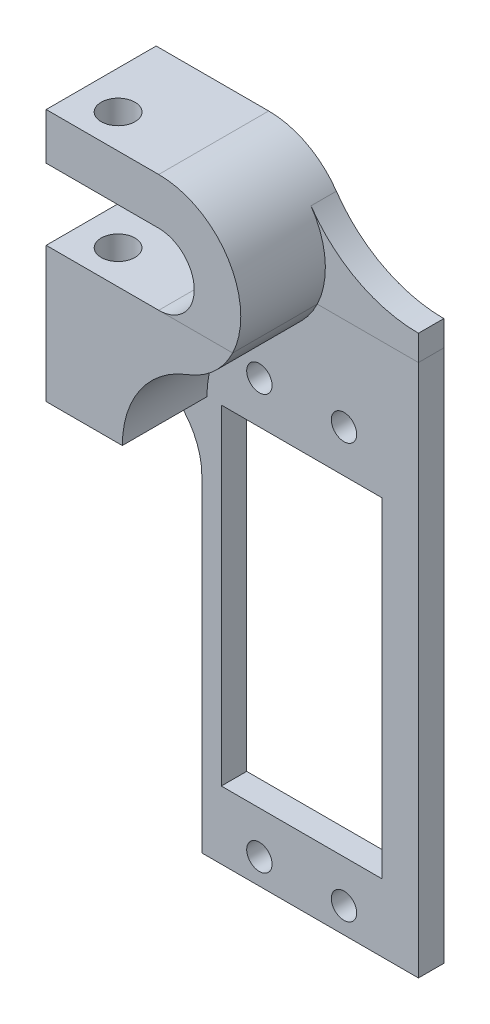
ISO-10303-21;
HEADER;
FILE_DESCRIPTION(('STEP AP214'),'2;1');
FILE_NAME('part.step','',(''),(''),'','','');
FILE_SCHEMA(('AUTOMOTIVE_DESIGN { 1 0 10303 214 1 1 1 1 }'));
ENDSEC;
DATA;
#1=APPLICATION_CONTEXT('core data for automotive mechanical design processes');
#2=APPLICATION_PROTOCOL_DEFINITION('international standard','automotive_design',2000,#1);
#3=PRODUCT_CONTEXT('',#1,'mechanical');
#4=PRODUCT('Part','Part','',(#3));
#5=PRODUCT_RELATED_PRODUCT_CATEGORY('part','',(#4));
#6=PRODUCT_DEFINITION_FORMATION('','',#4);
#7=PRODUCT_DEFINITION_CONTEXT('part definition',#1,'design');
#8=PRODUCT_DEFINITION('design','',#6,#7);
#9=PRODUCT_DEFINITION_SHAPE('','',#8);
#10=(LENGTH_UNIT() NAMED_UNIT(*) SI_UNIT(.MILLI.,.METRE.));
#11=(NAMED_UNIT(*) PLANE_ANGLE_UNIT() SI_UNIT($,.RADIAN.));
#12=(NAMED_UNIT(*) SI_UNIT($,.STERADIAN.) SOLID_ANGLE_UNIT());
#13=UNCERTAINTY_MEASURE_WITH_UNIT(LENGTH_MEASURE(1.E-05),#10,'distance_accuracy_value','');
#14=(GEOMETRIC_REPRESENTATION_CONTEXT(3) GLOBAL_UNCERTAINTY_ASSIGNED_CONTEXT((#13)) GLOBAL_UNIT_ASSIGNED_CONTEXT((#10,
#11,#12)) REPRESENTATION_CONTEXT('',''));
#15=CARTESIAN_POINT('',(0.,0.,0.));
#16=DIRECTION('',(0.,0.,1.));
#17=DIRECTION('',(1.,0.,0.));
#18=AXIS2_PLACEMENT_3D('',#15,#16,#17);
#19=CARTESIAN_POINT('',(-20.2,35.5,0.));
#20=DIRECTION('',(0.,1.,0.));
#21=DIRECTION('',(0.,0.,1.));
#22=AXIS2_PLACEMENT_3D('',#19,#20,#21);
#23=PLANE('',#22);
#24=DIRECTION('',(0.,0.,-1.));
#25=VECTOR('',#24,1.);
#26=CARTESIAN_POINT('',(13.8,35.5,3.));
#27=LINE('',#26,#25);
#28=CARTESIAN_POINT('',(13.8,35.5,3.));
#29=VERTEX_POINT('',#28);
#30=CARTESIAN_POINT('',(13.8,35.5,0.));
#31=VERTEX_POINT('',#30);
#32=EDGE_CURVE('E119',#29,#31,#27,.T.);
#33=ORIENTED_EDGE('',*,*,#32,.T.);
#34=DIRECTION('',(-1.,0.,0.));
#35=VECTOR('',#34,1.);
#36=CARTESIAN_POINT('',(-20.2,35.5,0.));
#37=LINE('',#36,#35);
#38=CARTESIAN_POINT('',(-20.2,35.5,0.));
#39=VERTEX_POINT('',#38);
#40=EDGE_CURVE('E112',#31,#39,#37,.T.);
#41=ORIENTED_EDGE('',*,*,#40,.T.);
#42=DIRECTION('',(0.,0.,-1.));
#43=VECTOR('',#42,1.);
#44=CARTESIAN_POINT('',(-20.2,35.5,3.));
#45=LINE('',#44,#43);
#46=CARTESIAN_POINT('',(-20.2,35.5,13.));
#47=VERTEX_POINT('',#46);
#48=EDGE_CURVE('E123',#47,#39,#45,.T.);
#49=ORIENTED_EDGE('',*,*,#48,.F.);
#50=DIRECTION('',(-1.,0.,0.));
#51=VECTOR('',#50,1.);
#52=CARTESIAN_POINT('',(-20.2,35.5,13.));
#53=LINE('',#52,#51);
#54=CARTESIAN_POINT('',(1.8435690653188,35.5,13.));
#55=VERTEX_POINT('',#54);
#56=EDGE_CURVE('E104',#55,#47,#53,.T.);
#57=ORIENTED_EDGE('',*,*,#56,.F.);
#58=DIRECTION('',(0.,0.,-1.));
#59=VECTOR('',#58,1.);
#60=CARTESIAN_POINT('',(1.8435690653188,35.5,3.));
#61=LINE('',#60,#59);
#62=CARTESIAN_POINT('',(1.8435690653188,35.5,3.));
#63=VERTEX_POINT('',#62);
#64=EDGE_CURVE('E103',#55,#63,#61,.T.);
#65=ORIENTED_EDGE('',*,*,#64,.T.);
#66=DIRECTION('',(-1.,0.,0.));
#67=VECTOR('',#66,1.);
#68=CARTESIAN_POINT('',(-20.2,35.5,3.));
#69=LINE('',#68,#67);
#70=EDGE_CURVE('E122',#29,#63,#69,.T.);
#71=ORIENTED_EDGE('',*,*,#70,.F.);
#72=EDGE_LOOP('',(#33,#41,#49,#57,#65,#71));
#73=FACE_BOUND('',#72,.T.);
#74=CARTESIAN_POINT('',(-15.7,35.5,9.));
#75=DIRECTION('',(0.,-1.,0.));
#76=DIRECTION('',(0.,0.,-1.));
#77=AXIS2_PLACEMENT_3D('',#74,#75,#76);
#78=CIRCLE('',#77,2.);
#79=CARTESIAN_POINT('',(-15.7,35.5,7.));
#80=VERTEX_POINT('',#79);
#81=EDGE_CURVE('E54',#80,#80,#78,.T.);
#82=ORIENTED_EDGE('',*,*,#81,.T.);
#83=EDGE_LOOP('',(#82));
#84=FACE_BOUND('',#83,.T.);
#85=ADVANCED_FACE('F44',(#73,#84),#23,.T.);
#86=CARTESIAN_POINT('',(-20.2,11.1,3.));
#87=DIRECTION('',(0.,0.,1.));
#88=DIRECTION('',(1.,0.,0.));
#89=AXIS2_PLACEMENT_3D('',#86,#87,#88);
#90=PLANE('',#89);
#91=CARTESIAN_POINT('',(5.,-24.5,3.));
#92=DIRECTION('',(0.,0.,1.));
#93=DIRECTION('',(1.,0.,0.));
#94=AXIS2_PLACEMENT_3D('',#91,#92,#93);
#95=CIRCLE('',#94,1.5);
#96=CARTESIAN_POINT('',(6.5,-24.5,3.));
#97=VERTEX_POINT('',#96);
#98=EDGE_CURVE('E137',#97,#97,#95,.T.);
#99=ORIENTED_EDGE('',*,*,#98,.F.);
#100=EDGE_LOOP('',(#99));
#101=FACE_BOUND('',#100,.T.);
#102=CARTESIAN_POINT('',(5.,24.5,3.));
#103=DIRECTION('',(0.,0.,1.));
#104=DIRECTION('',(1.,0.,0.));
#105=AXIS2_PLACEMENT_3D('',#102,#103,#104);
#106=CIRCLE('',#105,1.5);
#107=CARTESIAN_POINT('',(6.5,24.5,3.));
#108=VERTEX_POINT('',#107);
#109=EDGE_CURVE('E149',#108,#108,#106,.T.);
#110=ORIENTED_EDGE('',*,*,#109,.F.);
#111=EDGE_LOOP('',(#110));
#112=FACE_BOUND('',#111,.T.);
#113=DIRECTION('',(-1.,0.,0.));
#114=VECTOR('',#113,1.);
#115=CARTESIAN_POINT('',(-9.5,19.5,3.));
#116=LINE('',#115,#114);
#117=CARTESIAN_POINT('',(9.5,19.5,3.));
#118=VERTEX_POINT('',#117);
#119=CARTESIAN_POINT('',(-9.5,19.5,3.));
#120=VERTEX_POINT('',#119);
#121=EDGE_CURVE('E165',#118,#120,#116,.T.);
#122=ORIENTED_EDGE('',*,*,#121,.F.);
#123=DIRECTION('',(0.,1.,0.));
#124=VECTOR('',#123,1.);
#125=CARTESIAN_POINT('',(9.5,19.5,3.));
#126=LINE('',#125,#124);
#127=CARTESIAN_POINT('',(9.5,-19.5,3.));
#128=VERTEX_POINT('',#127);
#129=EDGE_CURVE('E161',#128,#118,#126,.T.);
#130=ORIENTED_EDGE('',*,*,#129,.F.);
#131=DIRECTION('',(1.,0.,0.));
#132=VECTOR('',#131,1.);
#133=CARTESIAN_POINT('',(-9.5,-19.5,3.));
#134=LINE('',#133,#132);
#135=CARTESIAN_POINT('',(-9.5,-19.5,3.));
#136=VERTEX_POINT('',#135);
#137=EDGE_CURVE('E171',#136,#128,#134,.T.);
#138=ORIENTED_EDGE('',*,*,#137,.F.);
#139=DIRECTION('',(0.,-1.,0.));
#140=VECTOR('',#139,1.);
#141=CARTESIAN_POINT('',(-9.5,19.5,3.));
#142=LINE('',#141,#140);
#143=EDGE_CURVE('E168',#120,#136,#142,.T.);
#144=ORIENTED_EDGE('',*,*,#143,.F.);
#145=EDGE_LOOP('',(#122,#130,#138,#144));
#146=FACE_BOUND('',#145,.T.);
#147=CARTESIAN_POINT('',(-5.,24.5,3.));
#148=DIRECTION('',(0.,0.,1.));
#149=DIRECTION('',(1.,0.,0.));
#150=AXIS2_PLACEMENT_3D('',#147,#148,#149);
#151=CIRCLE('',#150,1.5);
#152=CARTESIAN_POINT('',(-3.5,24.5,3.));
#153=VERTEX_POINT('',#152);
#154=EDGE_CURVE('E155',#153,#153,#151,.T.);
#155=ORIENTED_EDGE('',*,*,#154,.F.);
#156=EDGE_LOOP('',(#155));
#157=FACE_BOUND('',#156,.T.);
#158=CARTESIAN_POINT('',(-4.99999999999999,-24.5,3.));
#159=DIRECTION('',(0.,0.,1.));
#160=DIRECTION('',(1.,0.,0.));
#161=AXIS2_PLACEMENT_3D('',#158,#159,#160);
#162=CIRCLE('',#161,1.5);
#163=CARTESIAN_POINT('',(-3.49999999999999,-24.5,3.));
#164=VERTEX_POINT('',#163);
#165=EDGE_CURVE('E143',#164,#164,#162,.T.);
#166=ORIENTED_EDGE('',*,*,#165,.F.);
#167=EDGE_LOOP('',(#166));
#168=FACE_BOUND('',#167,.T.);
#169=DIRECTION('',(0.,1.,0.));
#170=VECTOR('',#169,1.);
#171=CARTESIAN_POINT('',(13.8,38.5,3.));
#172=LINE('',#171,#170);
#173=CARTESIAN_POINT('',(13.8,-27.5,3.));
#174=VERTEX_POINT('',#173);
#175=EDGE_CURVE('E113',#174,#29,#172,.T.);
#176=ORIENTED_EDGE('',*,*,#175,.T.);
#177=ORIENTED_EDGE('',*,*,#70,.T.);
#178=CARTESIAN_POINT('',(-6.90000000000001,39.7,3.));
#179=DIRECTION('',(0.,0.,1.));
#180=DIRECTION('',(1.,0.,0.));
#181=AXIS2_PLACEMENT_3D('',#178,#179,#180);
#182=CIRCLE('',#181,9.7);
#183=CARTESIAN_POINT('',(-3.49494735447985,30.6172902456791,3.));
#184=VERTEX_POINT('',#183);
#185=EDGE_CURVE('E48',#184,#63,#182,.T.);
#186=ORIENTED_EDGE('',*,*,#185,.F.);
#187=CARTESIAN_POINT('',(0.672857142857135,19.5,3.));
#188=DIRECTION('',(0.,0.,-1.));
#189=DIRECTION('',(1.,0.,0.));
#190=AXIS2_PLACEMENT_3D('',#187,#188,#189);
#191=CIRCLE('',#190,11.8728571428571);
#192=CARTESIAN_POINT('',(-11.2,19.5,3.));
#193=VERTEX_POINT('',#192);
#194=EDGE_CURVE('E95',#193,#184,#191,.T.);
#195=ORIENTED_EDGE('',*,*,#194,.F.);
#196=DIRECTION('',(1.,0.,0.));
#197=VECTOR('',#196,1.);
#198=CARTESIAN_POINT('',(-20.2,19.5,3.));
#199=LINE('',#198,#197);
#200=CARTESIAN_POINT('',(-20.2,19.5,3.));
#201=VERTEX_POINT('',#200);
#202=EDGE_CURVE('E127',#201,#193,#199,.T.);
#203=ORIENTED_EDGE('',*,*,#202,.F.);
#204=CARTESIAN_POINT('',(-20.2,11.1,3.));
#205=DIRECTION('',(0.,0.,-1.));
#206=DIRECTION('',(1.,0.,0.));
#207=AXIS2_PLACEMENT_3D('',#204,#205,#206);
#208=CIRCLE('',#207,8.4);
#209=CARTESIAN_POINT('',(-11.8,11.1,3.));
#210=VERTEX_POINT('',#209);
#211=EDGE_CURVE('E117',#201,#210,#208,.T.);
#212=ORIENTED_EDGE('',*,*,#211,.T.);
#213=DIRECTION('',(0.,-1.,0.));
#214=VECTOR('',#213,1.);
#215=CARTESIAN_POINT('',(-11.8,11.1,3.));
#216=LINE('',#215,#214);
#217=CARTESIAN_POINT('',(-11.8,-27.5,3.));
#218=VERTEX_POINT('',#217);
#219=EDGE_CURVE('E197',#210,#218,#216,.T.);
#220=ORIENTED_EDGE('',*,*,#219,.T.);
#221=DIRECTION('',(1.,0.,0.));
#222=VECTOR('',#221,1.);
#223=CARTESIAN_POINT('',(-11.8,-27.5,3.));
#224=LINE('',#223,#222);
#225=EDGE_CURVE('E200',#218,#174,#224,.T.);
#226=ORIENTED_EDGE('',*,*,#225,.T.);
#227=EDGE_LOOP('',(#176,#177,#186,#195,#203,#212,#220,#226));
#228=FACE_BOUND('',#227,.T.);
#229=ADVANCED_FACE('F266',(#101,#112,#146,#157,#168,#228),#90,.T.);
#230=CARTESIAN_POINT('',(-11.8,11.1,3.));
#231=DIRECTION('',(1.,0.,0.));
#232=DIRECTION('',(0.,1.,0.));
#233=AXIS2_PLACEMENT_3D('',#230,#231,#232);
#234=PLANE('',#233);
#235=DIRECTION('',(0.,-1.,0.));
#236=VECTOR('',#235,1.);
#237=CARTESIAN_POINT('',(-11.8,11.1,0.));
#238=LINE('',#237,#236);
#239=CARTESIAN_POINT('',(-11.8,11.1,0.));
#240=VERTEX_POINT('',#239);
#241=CARTESIAN_POINT('',(-11.8,-27.5,0.));
#242=VERTEX_POINT('',#241);
#243=EDGE_CURVE('E212',#240,#242,#238,.T.);
#244=ORIENTED_EDGE('',*,*,#243,.T.);
#245=DIRECTION('',(0.,0.,-1.));
#246=VECTOR('',#245,1.);
#247=CARTESIAN_POINT('',(-11.8,-27.5,3.));
#248=LINE('',#247,#246);
#249=EDGE_CURVE('E219',#218,#242,#248,.T.);
#250=ORIENTED_EDGE('',*,*,#249,.F.);
#251=ORIENTED_EDGE('',*,*,#219,.F.);
#252=DIRECTION('',(0.,0.,-1.));
#253=VECTOR('',#252,1.);
#254=CARTESIAN_POINT('',(-11.8,11.1,3.));
#255=LINE('',#254,#253);
#256=EDGE_CURVE('E222',#210,#240,#255,.T.);
#257=ORIENTED_EDGE('',*,*,#256,.T.);
#258=EDGE_LOOP('',(#244,#250,#251,#257));
#259=FACE_BOUND('',#258,.T.);
#260=ADVANCED_FACE('F260',(#259),#234,.F.);
#261=CARTESIAN_POINT('',(-11.8,-27.5,3.));
#262=DIRECTION('',(0.,1.,0.));
#263=DIRECTION('',(0.,0.,1.));
#264=AXIS2_PLACEMENT_3D('',#261,#262,#263);
#265=PLANE('',#264);
#266=DIRECTION('',(1.,0.,0.));
#267=VECTOR('',#266,1.);
#268=CARTESIAN_POINT('',(-11.8,-27.5,0.));
#269=LINE('',#268,#267);
#270=CARTESIAN_POINT('',(13.8,-27.5,0.));
#271=VERTEX_POINT('',#270);
#272=EDGE_CURVE('E116',#242,#271,#269,.T.);
#273=ORIENTED_EDGE('',*,*,#272,.T.);
#274=DIRECTION('',(0.,0.,-1.));
#275=VECTOR('',#274,1.);
#276=CARTESIAN_POINT('',(13.8,-27.5,3.));
#277=LINE('',#276,#275);
#278=EDGE_CURVE('E203',#174,#271,#277,.T.);
#279=ORIENTED_EDGE('',*,*,#278,.F.);
#280=ORIENTED_EDGE('',*,*,#225,.F.);
#281=ORIENTED_EDGE('',*,*,#249,.T.);
#282=EDGE_LOOP('',(#273,#279,#280,#281));
#283=FACE_BOUND('',#282,.T.);
#284=ADVANCED_FACE('F312',(#283),#265,.F.);
#285=CARTESIAN_POINT('',(13.8,38.5,3.));
#286=DIRECTION('',(-1.,0.,0.));
#287=DIRECTION('',(0.,-1.,0.));
#288=AXIS2_PLACEMENT_3D('',#285,#286,#287);
#289=PLANE('',#288);
#290=ORIENTED_EDGE('',*,*,#32,.F.);
#291=ORIENTED_EDGE('',*,*,#175,.F.);
#292=ORIENTED_EDGE('',*,*,#278,.T.);
#293=DIRECTION('',(0.,1.,0.));
#294=VECTOR('',#293,1.);
#295=CARTESIAN_POINT('',(13.8,38.5,0.));
#296=LINE('',#295,#294);
#297=EDGE_CURVE('E108',#271,#31,#296,.T.);
#298=ORIENTED_EDGE('',*,*,#297,.T.);
#299=EDGE_LOOP('',(#290,#291,#292,#298));
#300=FACE_BOUND('',#299,.T.);
#301=ADVANCED_FACE('F316',(#300),#289,.F.);
#302=CARTESIAN_POINT('',(-9.5,-19.5,3.));
#303=DIRECTION('',(0.,1.,0.));
#304=DIRECTION('',(0.,0.,1.));
#305=AXIS2_PLACEMENT_3D('',#302,#303,#304);
#306=PLANE('',#305);
#307=DIRECTION('',(1.,0.,0.));
#308=VECTOR('',#307,1.);
#309=CARTESIAN_POINT('',(-9.5,-19.5,0.));
#310=LINE('',#309,#308);
#311=CARTESIAN_POINT('',(-9.5,-19.5,0.));
#312=VERTEX_POINT('',#311);
#313=CARTESIAN_POINT('',(9.5,-19.5,0.));
#314=VERTEX_POINT('',#313);
#315=EDGE_CURVE('E164',#312,#314,#310,.T.);
#316=ORIENTED_EDGE('',*,*,#315,.F.);
#317=DIRECTION('',(0.,0.,-1.));
#318=VECTOR('',#317,1.);
#319=CARTESIAN_POINT('',(-9.5,-19.5,3.));
#320=LINE('',#319,#318);
#321=EDGE_CURVE('E187',#136,#312,#320,.T.);
#322=ORIENTED_EDGE('',*,*,#321,.F.);
#323=ORIENTED_EDGE('',*,*,#137,.T.);
#324=DIRECTION('',(0.,0.,-1.));
#325=VECTOR('',#324,1.);
#326=CARTESIAN_POINT('',(9.5,-19.5,3.));
#327=LINE('',#326,#325);
#328=EDGE_CURVE('E174',#128,#314,#327,.T.);
#329=ORIENTED_EDGE('',*,*,#328,.T.);
#330=EDGE_LOOP('',(#316,#322,#323,#329));
#331=FACE_BOUND('',#330,.T.);
#332=ADVANCED_FACE('F354',(#331),#306,.T.);
#333=CARTESIAN_POINT('',(-9.5,19.5,3.));
#334=DIRECTION('',(1.,0.,0.));
#335=DIRECTION('',(0.,1.,0.));
#336=AXIS2_PLACEMENT_3D('',#333,#334,#335);
#337=PLANE('',#336);
#338=DIRECTION('',(0.,-1.,0.));
#339=VECTOR('',#338,1.);
#340=CARTESIAN_POINT('',(-9.5,19.5,0.));
#341=LINE('',#340,#339);
#342=CARTESIAN_POINT('',(-9.5,19.5,0.));
#343=VERTEX_POINT('',#342);
#344=EDGE_CURVE('E180',#343,#312,#341,.T.);
#345=ORIENTED_EDGE('',*,*,#344,.F.);
#346=DIRECTION('',(0.,0.,-1.));
#347=VECTOR('',#346,1.);
#348=CARTESIAN_POINT('',(-9.5,19.5,3.));
#349=LINE('',#348,#347);
#350=EDGE_CURVE('E190',#120,#343,#349,.T.);
#351=ORIENTED_EDGE('',*,*,#350,.F.);
#352=ORIENTED_EDGE('',*,*,#143,.T.);
#353=ORIENTED_EDGE('',*,*,#321,.T.);
#354=EDGE_LOOP('',(#345,#351,#352,#353));
#355=FACE_BOUND('',#354,.T.);
#356=ADVANCED_FACE('F300',(#355),#337,.T.);
#357=CARTESIAN_POINT('',(-9.5,19.5,3.));
#358=DIRECTION('',(0.,-1.,0.));
#359=DIRECTION('',(0.,0.,-1.));
#360=AXIS2_PLACEMENT_3D('',#357,#358,#359);
#361=PLANE('',#360);
#362=DIRECTION('',(-1.,0.,0.));
#363=VECTOR('',#362,1.);
#364=CARTESIAN_POINT('',(-9.5,19.5,0.));
#365=LINE('',#364,#363);
#366=CARTESIAN_POINT('',(9.5,19.5,0.));
#367=VERTEX_POINT('',#366);
#368=EDGE_CURVE('E177',#367,#343,#365,.T.);
#369=ORIENTED_EDGE('',*,*,#368,.F.);
#370=DIRECTION('',(0.,0.,-1.));
#371=VECTOR('',#370,1.);
#372=CARTESIAN_POINT('',(9.5,19.5,3.));
#373=LINE('',#372,#371);
#374=EDGE_CURVE('E111',#118,#367,#373,.T.);
#375=ORIENTED_EDGE('',*,*,#374,.F.);
#376=ORIENTED_EDGE('',*,*,#121,.T.);
#377=ORIENTED_EDGE('',*,*,#350,.T.);
#378=EDGE_LOOP('',(#369,#375,#376,#377));
#379=FACE_BOUND('',#378,.T.);
#380=ADVANCED_FACE('F294',(#379),#361,.T.);
#381=CARTESIAN_POINT('',(9.5,19.5,3.));
#382=DIRECTION('',(-1.,0.,0.));
#383=DIRECTION('',(0.,-1.,0.));
#384=AXIS2_PLACEMENT_3D('',#381,#382,#383);
#385=PLANE('',#384);
#386=DIRECTION('',(0.,1.,0.));
#387=VECTOR('',#386,1.);
#388=CARTESIAN_POINT('',(9.5,19.5,0.));
#389=LINE('',#388,#387);
#390=EDGE_CURVE('E158',#314,#367,#389,.T.);
#391=ORIENTED_EDGE('',*,*,#390,.F.);
#392=ORIENTED_EDGE('',*,*,#328,.F.);
#393=ORIENTED_EDGE('',*,*,#129,.T.);
#394=ORIENTED_EDGE('',*,*,#374,.T.);
#395=EDGE_LOOP('',(#391,#392,#393,#394));
#396=FACE_BOUND('',#395,.T.);
#397=ADVANCED_FACE('F291',(#396),#385,.T.);
#398=CARTESIAN_POINT('',(-5.,24.5,3.));
#399=DIRECTION('',(0.,0.,-1.));
#400=DIRECTION('',(-1.,0.,0.));
#401=AXIS2_PLACEMENT_3D('',#398,#399,#400);
#402=CYLINDRICAL_SURFACE('',#401,1.5);
#403=ORIENTED_EDGE('',*,*,#154,.T.);
#404=EDGE_LOOP('',(#403));
#405=FACE_BOUND('',#404,.T.);
#406=CARTESIAN_POINT('',(-5.,24.5,0.));
#407=DIRECTION('',(0.,0.,1.));
#408=DIRECTION('',(1.,0.,0.));
#409=AXIS2_PLACEMENT_3D('',#406,#407,#408);
#410=CIRCLE('',#409,1.5);
#411=CARTESIAN_POINT('',(-3.5,24.5,0.));
#412=VERTEX_POINT('',#411);
#413=EDGE_CURVE('E152',#412,#412,#410,.T.);
#414=ORIENTED_EDGE('',*,*,#413,.F.);
#415=EDGE_LOOP('',(#414));
#416=FACE_BOUND('',#415,.T.);
#417=ADVANCED_FACE('F426',(#405,#416),#402,.F.);
#418=CARTESIAN_POINT('',(5.,24.5,3.));
#419=DIRECTION('',(0.,0.,-1.));
#420=DIRECTION('',(-1.,0.,0.));
#421=AXIS2_PLACEMENT_3D('',#418,#419,#420);
#422=CYLINDRICAL_SURFACE('',#421,1.5);
#423=ORIENTED_EDGE('',*,*,#109,.T.);
#424=EDGE_LOOP('',(#423));
#425=FACE_BOUND('',#424,.T.);
#426=CARTESIAN_POINT('',(5.,24.5,0.));
#427=DIRECTION('',(0.,0.,1.));
#428=DIRECTION('',(1.,0.,0.));
#429=AXIS2_PLACEMENT_3D('',#426,#427,#428);
#430=CIRCLE('',#429,1.5);
#431=CARTESIAN_POINT('',(6.5,24.5,0.));
#432=VERTEX_POINT('',#431);
#433=EDGE_CURVE('E146',#432,#432,#430,.T.);
#434=ORIENTED_EDGE('',*,*,#433,.F.);
#435=EDGE_LOOP('',(#434));
#436=FACE_BOUND('',#435,.T.);
#437=ADVANCED_FACE('F416',(#425,#436),#422,.F.);
#438=CARTESIAN_POINT('',(-4.99999999999999,-24.5,3.));
#439=DIRECTION('',(0.,0.,-1.));
#440=DIRECTION('',(-1.,0.,0.));
#441=AXIS2_PLACEMENT_3D('',#438,#439,#440);
#442=CYLINDRICAL_SURFACE('',#441,1.5);
#443=ORIENTED_EDGE('',*,*,#165,.T.);
#444=EDGE_LOOP('',(#443));
#445=FACE_BOUND('',#444,.T.);
#446=CARTESIAN_POINT('',(-4.99999999999999,-24.5,0.));
#447=DIRECTION('',(0.,0.,1.));
#448=DIRECTION('',(1.,0.,0.));
#449=AXIS2_PLACEMENT_3D('',#446,#447,#448);
#450=CIRCLE('',#449,1.5);
#451=CARTESIAN_POINT('',(-3.49999999999999,-24.5,0.));
#452=VERTEX_POINT('',#451);
#453=EDGE_CURVE('E140',#452,#452,#450,.T.);
#454=ORIENTED_EDGE('',*,*,#453,.F.);
#455=EDGE_LOOP('',(#454));
#456=FACE_BOUND('',#455,.T.);
#457=ADVANCED_FACE('F407',(#445,#456),#442,.F.);
#458=CARTESIAN_POINT('',(5.,-24.5,3.));
#459=DIRECTION('',(0.,0.,-1.));
#460=DIRECTION('',(-1.,0.,0.));
#461=AXIS2_PLACEMENT_3D('',#458,#459,#460);
#462=CYLINDRICAL_SURFACE('',#461,1.5);
#463=ORIENTED_EDGE('',*,*,#98,.T.);
#464=EDGE_LOOP('',(#463));
#465=FACE_BOUND('',#464,.T.);
#466=CARTESIAN_POINT('',(5.,-24.5,0.));
#467=DIRECTION('',(0.,0.,1.));
#468=DIRECTION('',(1.,0.,0.));
#469=AXIS2_PLACEMENT_3D('',#466,#467,#468);
#470=CIRCLE('',#469,1.5);
#471=CARTESIAN_POINT('',(6.5,-24.5,0.));
#472=VERTEX_POINT('',#471);
#473=EDGE_CURVE('E136',#472,#472,#470,.T.);
#474=ORIENTED_EDGE('',*,*,#473,.F.);
#475=EDGE_LOOP('',(#474));
#476=FACE_BOUND('',#475,.T.);
#477=ADVANCED_FACE('F398',(#465,#476),#462,.F.);
#478=CARTESIAN_POINT('',(-20.2,11.1,3.));
#479=DIRECTION('',(0.,0.,-1.));
#480=DIRECTION('',(-1.,0.,0.));
#481=AXIS2_PLACEMENT_3D('',#478,#479,#480);
#482=CYLINDRICAL_SURFACE('',#481,8.4);
#483=CARTESIAN_POINT('',(-20.2,11.1,0.));
#484=DIRECTION('',(0.,0.,-1.));
#485=DIRECTION('',(1.,0.,0.));
#486=AXIS2_PLACEMENT_3D('',#483,#484,#485);
#487=CIRCLE('',#486,8.4);
#488=CARTESIAN_POINT('',(-20.2,19.5,0.));
#489=VERTEX_POINT('',#488);
#490=EDGE_CURVE('E209',#489,#240,#487,.T.);
#491=ORIENTED_EDGE('',*,*,#490,.T.);
#492=ORIENTED_EDGE('',*,*,#256,.F.);
#493=ORIENTED_EDGE('',*,*,#211,.F.);
#494=DIRECTION('',(0.,0.,-1.));
#495=VECTOR('',#494,1.);
#496=CARTESIAN_POINT('',(-20.2,19.5,3.));
#497=LINE('',#496,#495);
#498=EDGE_CURVE('E225',#201,#489,#497,.T.);
#499=ORIENTED_EDGE('',*,*,#498,.T.);
#500=EDGE_LOOP('',(#491,#492,#493,#499));
#501=FACE_BOUND('',#500,.T.);
#502=ADVANCED_FACE('F253',(#501),#482,.F.);
#503=CARTESIAN_POINT('',(-20.2,11.1,0.));
#504=DIRECTION('',(0.,0.,1.));
#505=DIRECTION('',(1.,0.,0.));
#506=AXIS2_PLACEMENT_3D('',#503,#504,#505);
#507=PLANE('',#506);
#508=ORIENTED_EDGE('',*,*,#473,.T.);
#509=EDGE_LOOP('',(#508));
#510=FACE_BOUND('',#509,.T.);
#511=ORIENTED_EDGE('',*,*,#453,.T.);
#512=EDGE_LOOP('',(#511));
#513=FACE_BOUND('',#512,.T.);
#514=ORIENTED_EDGE('',*,*,#433,.T.);
#515=EDGE_LOOP('',(#514));
#516=FACE_BOUND('',#515,.T.);
#517=ORIENTED_EDGE('',*,*,#413,.T.);
#518=EDGE_LOOP('',(#517));
#519=FACE_BOUND('',#518,.T.);
#520=ORIENTED_EDGE('',*,*,#390,.T.);
#521=ORIENTED_EDGE('',*,*,#368,.T.);
#522=ORIENTED_EDGE('',*,*,#344,.T.);
#523=ORIENTED_EDGE('',*,*,#315,.T.);
#524=EDGE_LOOP('',(#520,#521,#522,#523));
#525=FACE_BOUND('',#524,.T.);
#526=ORIENTED_EDGE('',*,*,#40,.F.);
#527=ORIENTED_EDGE('',*,*,#297,.F.);
#528=ORIENTED_EDGE('',*,*,#272,.F.);
#529=ORIENTED_EDGE('',*,*,#243,.F.);
#530=ORIENTED_EDGE('',*,*,#490,.F.);
#531=DIRECTION('',(0.,-1.,0.));
#532=VECTOR('',#531,1.);
#533=CARTESIAN_POINT('',(-20.2,19.5,0.));
#534=LINE('',#533,#532);
#535=EDGE_CURVE('E206',#39,#489,#534,.T.);
#536=ORIENTED_EDGE('',*,*,#535,.F.);
#537=EDGE_LOOP('',(#526,#527,#528,#529,#530,#536));
#538=FACE_BOUND('',#537,.T.);
#539=ADVANCED_FACE('F244',(#510,#513,#516,#519,#525,#538),#507,.F.);
#540=CARTESIAN_POINT('',(0.672857142857135,19.5,13.));
#541=DIRECTION('',(0.,0.,-1.));
#542=DIRECTION('',(-1.,0.,0.));
#543=AXIS2_PLACEMENT_3D('',#540,#541,#542);
#544=CYLINDRICAL_SURFACE('',#543,11.8728571428571);
#545=ORIENTED_EDGE('',*,*,#194,.T.);
#546=DIRECTION('',(0.,0.,-1.));
#547=VECTOR('',#546,1.);
#548=CARTESIAN_POINT('',(-3.49494735447985,30.6172902456791,13.));
#549=LINE('',#548,#547);
#550=CARTESIAN_POINT('',(-3.49494735447985,30.6172902456791,13.));
#551=VERTEX_POINT('',#550);
#552=EDGE_CURVE('E93',#551,#184,#549,.T.);
#553=ORIENTED_EDGE('',*,*,#552,.F.);
#554=CARTESIAN_POINT('',(0.672857142857135,19.5,13.));
#555=DIRECTION('',(0.,0.,-1.));
#556=DIRECTION('',(1.,0.,0.));
#557=AXIS2_PLACEMENT_3D('',#554,#555,#556);
#558=CIRCLE('',#557,11.8728571428571);
#559=CARTESIAN_POINT('',(-11.2,19.5,13.));
#560=VERTEX_POINT('',#559);
#561=EDGE_CURVE('E79',#560,#551,#558,.T.);
#562=ORIENTED_EDGE('',*,*,#561,.F.);
#563=DIRECTION('',(0.,0.,-1.));
#564=VECTOR('',#563,1.);
#565=CARTESIAN_POINT('',(-11.2,19.5,13.));
#566=LINE('',#565,#564);
#567=EDGE_CURVE('E98',#560,#193,#566,.T.);
#568=ORIENTED_EDGE('',*,*,#567,.T.);
#569=EDGE_LOOP('',(#545,#553,#562,#568));
#570=FACE_BOUND('',#569,.T.);
#571=ADVANCED_FACE('F94',(#570),#544,.F.);
#572=CARTESIAN_POINT('',(-20.2,19.5,13.));
#573=DIRECTION('',(0.,1.,0.));
#574=DIRECTION('',(0.,0.,1.));
#575=AXIS2_PLACEMENT_3D('',#572,#573,#574);
#576=PLANE('',#575);
#577=CARTESIAN_POINT('',(-15.7,19.5,9.));
#578=DIRECTION('',(0.,-1.,0.));
#579=DIRECTION('',(0.,0.,-1.));
#580=AXIS2_PLACEMENT_3D('',#577,#578,#579);
#581=CIRCLE('',#580,2.);
#582=CARTESIAN_POINT('',(-15.7,19.5,7.));
#583=VERTEX_POINT('',#582);
#584=EDGE_CURVE('E12',#583,#583,#581,.T.);
#585=ORIENTED_EDGE('',*,*,#584,.F.);
#586=EDGE_LOOP('',(#585));
#587=FACE_BOUND('',#586,.T.);
#588=ORIENTED_EDGE('',*,*,#202,.T.);
#589=ORIENTED_EDGE('',*,*,#567,.F.);
#590=DIRECTION('',(1.,0.,0.));
#591=VECTOR('',#590,1.);
#592=CARTESIAN_POINT('',(-20.2,19.5,13.));
#593=LINE('',#592,#591);
#594=CARTESIAN_POINT('',(-20.2,19.5,13.));
#595=VERTEX_POINT('',#594);
#596=EDGE_CURVE('E87',#595,#560,#593,.T.);
#597=ORIENTED_EDGE('',*,*,#596,.F.);
#598=DIRECTION('',(0.,0.,-1.));
#599=VECTOR('',#598,1.);
#600=CARTESIAN_POINT('',(-20.2,19.5,13.));
#601=LINE('',#600,#599);
#602=EDGE_CURVE('E97',#595,#201,#601,.T.);
#603=ORIENTED_EDGE('',*,*,#602,.T.);
#604=EDGE_LOOP('',(#588,#589,#597,#603));
#605=FACE_BOUND('',#604,.T.);
#606=ADVANCED_FACE('F325',(#587,#605),#576,.F.);
#607=CARTESIAN_POINT('',(-15.7,55.0568542494924,9.));
#608=DIRECTION('',(0.,-1.,0.));
#609=DIRECTION('',(0.,0.,-1.));
#610=AXIS2_PLACEMENT_3D('',#607,#608,#609);
#611=CYLINDRICAL_SURFACE('',#610,2.);
#612=ORIENTED_EDGE('',*,*,#584,.T.);
#613=EDGE_LOOP('',(#612));
#614=FACE_BOUND('',#613,.T.);
#615=ORIENTED_EDGE('',*,*,#81,.F.);
#616=EDGE_LOOP('',(#615));
#617=FACE_BOUND('',#616,.T.);
#618=ADVANCED_FACE('F46',(#614,#617),#611,.F.);
#619=CARTESIAN_POINT('',(-20.2,19.5,3.));
#620=DIRECTION('',(1.,0.,0.));
#621=DIRECTION('',(0.,1.,0.));
#622=AXIS2_PLACEMENT_3D('',#619,#620,#621);
#623=PLANE('',#622);
#624=ORIENTED_EDGE('',*,*,#535,.T.);
#625=ORIENTED_EDGE('',*,*,#498,.F.);
#626=ORIENTED_EDGE('',*,*,#602,.F.);
#627=DIRECTION('',(0.,-1.,0.));
#628=VECTOR('',#627,1.);
#629=CARTESIAN_POINT('',(-20.2,19.5,13.));
#630=LINE('',#629,#628);
#631=EDGE_CURVE('E105',#47,#595,#630,.T.);
#632=ORIENTED_EDGE('',*,*,#631,.F.);
#633=ORIENTED_EDGE('',*,*,#48,.T.);
#634=EDGE_LOOP('',(#624,#625,#626,#632,#633));
#635=FACE_BOUND('',#634,.T.);
#636=ADVANCED_FACE('F233',(#635),#623,.F.);
#637=CARTESIAN_POINT('',(-6.9,39.7,3.));
#638=DIRECTION('',(0.,0.,-1.));
#639=DIRECTION('',(-1.,0.,0.));
#640=AXIS2_PLACEMENT_3D('',#637,#638,#639);
#641=CYLINDRICAL_SURFACE('',#640,9.7);
#642=ORIENTED_EDGE('',*,*,#64,.F.);
#643=CARTESIAN_POINT('',(-6.90000000000001,39.7,13.));
#644=DIRECTION('',(0.,0.,1.));
#645=DIRECTION('',(1.,0.,0.));
#646=AXIS2_PLACEMENT_3D('',#643,#644,#645);
#647=CIRCLE('',#646,9.7);
#648=EDGE_CURVE('E85',#551,#55,#647,.T.);
#649=ORIENTED_EDGE('',*,*,#648,.F.);
#650=ORIENTED_EDGE('',*,*,#552,.T.);
#651=ORIENTED_EDGE('',*,*,#185,.T.);
#652=EDGE_LOOP('',(#642,#649,#650,#651));
#653=FACE_BOUND('',#652,.T.);
#654=ADVANCED_FACE('F101',(#653),#641,.T.);
#655=CARTESIAN_POINT('',(0.672857142857135,19.5,13.));
#656=DIRECTION('',(0.,0.,1.));
#657=DIRECTION('',(1.,0.,0.));
#658=AXIS2_PLACEMENT_3D('',#655,#656,#657);
#659=PLANE('',#658);
#660=ORIENTED_EDGE('',*,*,#648,.T.);
#661=ORIENTED_EDGE('',*,*,#56,.T.);
#662=ORIENTED_EDGE('',*,*,#631,.T.);
#663=ORIENTED_EDGE('',*,*,#596,.T.);
#664=ORIENTED_EDGE('',*,*,#561,.T.);
#665=EDGE_LOOP('',(#660,#661,#662,#663,#664));
#666=FACE_BOUND('',#665,.T.);
#667=ADVANCED_FACE('F81',(#666),#659,.T.);
#668=CLOSED_SHELL('',(#85,#229,#260,#284,#301,#332,#356,#380,#397,#417,#437,#457,#477,#502,#539,
#571,#606,#618,#636,#654,#667));
#669=MANIFOLD_SOLID_BREP('B2',#668);
#670=CARTESIAN_POINT('',(-20.2,35.5,0.));
#671=DIRECTION('',(0.,1.,0.));
#672=DIRECTION('',(0.,0.,1.));
#673=AXIS2_PLACEMENT_3D('',#670,#671,#672);
#674=PLANE('',#673);
#675=DIRECTION('',(0.,0.,-1.));
#676=VECTOR('',#675,1.);
#677=CARTESIAN_POINT('',(13.8,35.5,3.));
#678=LINE('',#677,#676);
#679=CARTESIAN_POINT('',(13.8,35.5,3.));
#680=VERTEX_POINT('',#679);
#681=CARTESIAN_POINT('',(13.8,35.5,0.));
#682=VERTEX_POINT('',#681);
#683=EDGE_CURVE('E684',#680,#682,#678,.T.);
#684=ORIENTED_EDGE('',*,*,#683,.F.);
#685=DIRECTION('',(-1.,0.,0.));
#686=VECTOR('',#685,1.);
#687=CARTESIAN_POINT('',(-20.2,35.5,3.));
#688=LINE('',#687,#686);
#689=CARTESIAN_POINT('',(1.8435690653188,35.5,3.));
#690=VERTEX_POINT('',#689);
#691=EDGE_CURVE('E682',#680,#690,#688,.T.);
#692=ORIENTED_EDGE('',*,*,#691,.T.);
#693=DIRECTION('',(0.,0.,-1.));
#694=VECTOR('',#693,1.);
#695=CARTESIAN_POINT('',(1.8435690653188,35.5,3.));
#696=LINE('',#695,#694);
#697=CARTESIAN_POINT('',(1.8435690653188,35.5,13.));
#698=VERTEX_POINT('',#697);
#699=EDGE_CURVE('E680',#698,#690,#696,.T.);
#700=ORIENTED_EDGE('',*,*,#699,.F.);
#701=DIRECTION('',(-1.,0.,0.));
#702=VECTOR('',#701,1.);
#703=CARTESIAN_POINT('',(0.672857142857135,35.5,13.));
#704=LINE('',#703,#702);
#705=CARTESIAN_POINT('',(-6.9,35.5,13.));
#706=VERTEX_POINT('',#705);
#707=EDGE_CURVE('E551',#698,#706,#704,.T.);
#708=ORIENTED_EDGE('',*,*,#707,.T.);
#709=DIRECTION('',(0.,0.,-1.));
#710=VECTOR('',#709,1.);
#711=CARTESIAN_POINT('',(-6.9,35.5,3.));
#712=LINE('',#711,#710);
#713=CARTESIAN_POINT('',(-6.9,35.5,0.));
#714=VERTEX_POINT('',#713);
#715=EDGE_CURVE('E42',#706,#714,#712,.T.);
#716=ORIENTED_EDGE('',*,*,#715,.T.);
#717=DIRECTION('',(-1.,0.,0.));
#718=VECTOR('',#717,1.);
#719=CARTESIAN_POINT('',(-20.2,35.5,0.));
#720=LINE('',#719,#718);
#721=EDGE_CURVE('E546',#682,#714,#720,.T.);
#722=ORIENTED_EDGE('',*,*,#721,.F.);
#723=EDGE_LOOP('',(#684,#692,#700,#708,#716,#722));
#724=FACE_BOUND('',#723,.T.);
#725=ADVANCED_FACE('F543',(#724),#674,.F.);
#726=CARTESIAN_POINT('',(-20.2,11.1,3.));
#727=DIRECTION('',(0.,0.,1.));
#728=DIRECTION('',(1.,0.,0.));
#729=AXIS2_PLACEMENT_3D('',#726,#727,#728);
#730=PLANE('',#729);
#731=ORIENTED_EDGE('',*,*,#691,.F.);
#732=DIRECTION('',(0.,1.,0.));
#733=VECTOR('',#732,1.);
#734=CARTESIAN_POINT('',(13.8,38.5,3.));
#735=LINE('',#734,#733);
#736=CARTESIAN_POINT('',(13.8,38.5,3.));
#737=VERTEX_POINT('',#736);
#738=EDGE_CURVE('E652',#680,#737,#735,.T.);
#739=ORIENTED_EDGE('',*,*,#738,.T.);
#740=CARTESIAN_POINT('',(13.8,53.905504587156,3.));
#741=DIRECTION('',(0.,0.,-1.));
#742=DIRECTION('',(1.,0.,0.));
#743=AXIS2_PLACEMENT_3D('',#740,#741,#742);
#744=CIRCLE('',#743,15.405504587156);
#745=CARTESIAN_POINT('',(1.09784761556733,45.1885729947013,3.));
#746=VERTEX_POINT('',#745);
#747=EDGE_CURVE('E654',#737,#746,#744,.T.);
#748=ORIENTED_EDGE('',*,*,#747,.T.);
#749=CARTESIAN_POINT('',(-6.90000000000001,39.7,3.));
#750=DIRECTION('',(0.,0.,1.));
#751=DIRECTION('',(1.,0.,0.));
#752=AXIS2_PLACEMENT_3D('',#749,#750,#751);
#753=CIRCLE('',#752,9.7);
#754=EDGE_CURVE('E624',#690,#746,#753,.T.);
#755=ORIENTED_EDGE('',*,*,#754,.F.);
#756=EDGE_LOOP('',(#731,#739,#748,#755));
#757=FACE_BOUND('',#756,.T.);
#758=ADVANCED_FACE('F701',(#757),#730,.T.);
#759=CARTESIAN_POINT('',(-20.2,11.1,0.));
#760=DIRECTION('',(0.,0.,1.));
#761=DIRECTION('',(1.,0.,0.));
#762=AXIS2_PLACEMENT_3D('',#759,#760,#761);
#763=PLANE('',#762);
#764=DIRECTION('',(0.,1.,0.));
#765=VECTOR('',#764,1.);
#766=CARTESIAN_POINT('',(13.8,38.5,0.));
#767=LINE('',#766,#765);
#768=CARTESIAN_POINT('',(13.8,38.5,0.));
#769=VERTEX_POINT('',#768);
#770=EDGE_CURVE('E649',#682,#769,#767,.T.);
#771=ORIENTED_EDGE('',*,*,#770,.F.);
#772=ORIENTED_EDGE('',*,*,#721,.T.);
#773=CARTESIAN_POINT('',(-6.9,39.7,0.));
#774=DIRECTION('',(0.,0.,-1.));
#775=DIRECTION('',(1.,0.,0.));
#776=AXIS2_PLACEMENT_3D('',#773,#774,#775);
#777=CIRCLE('',#776,4.2);
#778=CARTESIAN_POINT('',(-6.9,43.9,0.));
#779=VERTEX_POINT('',#778);
#780=EDGE_CURVE('E655',#779,#714,#777,.T.);
#781=ORIENTED_EDGE('',*,*,#780,.F.);
#782=DIRECTION('',(1.,0.,0.));
#783=VECTOR('',#782,1.);
#784=CARTESIAN_POINT('',(-20.2,43.9,0.));
#785=LINE('',#784,#783);
#786=CARTESIAN_POINT('',(-20.2,43.9,0.));
#787=VERTEX_POINT('',#786);
#788=EDGE_CURVE('E667',#787,#779,#785,.T.);
#789=ORIENTED_EDGE('',*,*,#788,.F.);
#790=DIRECTION('',(0.,-1.,0.));
#791=VECTOR('',#790,1.);
#792=CARTESIAN_POINT('',(-20.2,43.9,0.));
#793=LINE('',#792,#791);
#794=CARTESIAN_POINT('',(-20.2,49.4,0.));
#795=VERTEX_POINT('',#794);
#796=EDGE_CURVE('E665',#795,#787,#793,.T.);
#797=ORIENTED_EDGE('',*,*,#796,.F.);
#798=DIRECTION('',(-1.,0.,0.));
#799=VECTOR('',#798,1.);
#800=CARTESIAN_POINT('',(-20.2,49.4,0.));
#801=LINE('',#800,#799);
#802=CARTESIAN_POINT('',(-6.9,49.4,0.));
#803=VERTEX_POINT('',#802);
#804=EDGE_CURVE('E663',#803,#795,#801,.T.);
#805=ORIENTED_EDGE('',*,*,#804,.F.);
#806=CARTESIAN_POINT('',(-6.9,39.7,0.));
#807=DIRECTION('',(0.,0.,1.));
#808=DIRECTION('',(1.,0.,0.));
#809=AXIS2_PLACEMENT_3D('',#806,#807,#808);
#810=CIRCLE('',#809,9.7);
#811=CARTESIAN_POINT('',(1.09784761556733,45.1885729947013,0.));
#812=VERTEX_POINT('',#811);
#813=EDGE_CURVE('E631',#812,#803,#810,.T.);
#814=ORIENTED_EDGE('',*,*,#813,.F.);
#815=CARTESIAN_POINT('',(13.8,53.905504587156,0.));
#816=DIRECTION('',(0.,0.,-1.));
#817=DIRECTION('',(1.,0.,0.));
#818=AXIS2_PLACEMENT_3D('',#815,#816,#817);
#819=CIRCLE('',#818,15.405504587156);
#820=EDGE_CURVE('E660',#769,#812,#819,.T.);
#821=ORIENTED_EDGE('',*,*,#820,.F.);
#822=EDGE_LOOP('',(#771,#772,#781,#789,#797,#805,#814,#821));
#823=FACE_BOUND('',#822,.T.);
#824=ADVANCED_FACE('F694',(#823),#763,.F.);
#825=CARTESIAN_POINT('',(13.8,38.5,3.));
#826=DIRECTION('',(-1.,0.,0.));
#827=DIRECTION('',(0.,-1.,0.));
#828=AXIS2_PLACEMENT_3D('',#825,#826,#827);
#829=PLANE('',#828);
#830=ORIENTED_EDGE('',*,*,#738,.F.);
#831=ORIENTED_EDGE('',*,*,#683,.T.);
#832=ORIENTED_EDGE('',*,*,#770,.T.);
#833=DIRECTION('',(0.,0.,-1.));
#834=VECTOR('',#833,1.);
#835=CARTESIAN_POINT('',(13.8,38.5,3.));
#836=LINE('',#835,#834);
#837=EDGE_CURVE('E677',#737,#769,#836,.T.);
#838=ORIENTED_EDGE('',*,*,#837,.F.);
#839=EDGE_LOOP('',(#830,#831,#832,#838));
#840=FACE_BOUND('',#839,.T.);
#841=ADVANCED_FACE('F690',(#840),#829,.F.);
#842=CARTESIAN_POINT('',(13.8,53.905504587156,3.));
#843=DIRECTION('',(0.,0.,-1.));
#844=DIRECTION('',(-1.,0.,0.));
#845=AXIS2_PLACEMENT_3D('',#842,#843,#844);
#846=CYLINDRICAL_SURFACE('',#845,15.405504587156);
#847=ORIENTED_EDGE('',*,*,#820,.T.);
#848=DIRECTION('',(0.,0.,-1.));
#849=VECTOR('',#848,1.);
#850=CARTESIAN_POINT('',(1.09784761556733,45.1885729947013,3.));
#851=LINE('',#850,#849);
#852=EDGE_CURVE('E634',#746,#812,#851,.T.);
#853=ORIENTED_EDGE('',*,*,#852,.F.);
#854=ORIENTED_EDGE('',*,*,#747,.F.);
#855=ORIENTED_EDGE('',*,*,#837,.T.);
#856=EDGE_LOOP('',(#847,#853,#854,#855));
#857=FACE_BOUND('',#856,.T.);
#858=ADVANCED_FACE('F698',(#857),#846,.F.);
#859=CARTESIAN_POINT('',(-6.9,39.7,3.));
#860=DIRECTION('',(0.,0.,-1.));
#861=DIRECTION('',(-1.,0.,0.));
#862=AXIS2_PLACEMENT_3D('',#859,#860,#861);
#863=CYLINDRICAL_SURFACE('',#862,9.7);
#864=CARTESIAN_POINT('',(-6.90000000000001,39.7,13.));
#865=DIRECTION('',(0.,0.,1.));
#866=DIRECTION('',(1.,0.,0.));
#867=AXIS2_PLACEMENT_3D('',#864,#865,#866);
#868=CIRCLE('',#867,9.7);
#869=CARTESIAN_POINT('',(-6.9,49.4,13.));
#870=VERTEX_POINT('',#869);
#871=EDGE_CURVE('E614',#698,#870,#868,.T.);
#872=ORIENTED_EDGE('',*,*,#871,.F.);
#873=ORIENTED_EDGE('',*,*,#699,.T.);
#874=ORIENTED_EDGE('',*,*,#754,.T.);
#875=ORIENTED_EDGE('',*,*,#852,.T.);
#876=ORIENTED_EDGE('',*,*,#813,.T.);
#877=DIRECTION('',(0.,0.,-1.));
#878=VECTOR('',#877,1.);
#879=CARTESIAN_POINT('',(-6.9,49.4,3.));
#880=LINE('',#879,#878);
#881=EDGE_CURVE('E627',#870,#803,#880,.T.);
#882=ORIENTED_EDGE('',*,*,#881,.F.);
#883=EDGE_LOOP('',(#872,#873,#874,#875,#876,#882));
#884=FACE_BOUND('',#883,.T.);
#885=ADVANCED_FACE('F628',(#884),#863,.T.);
#886=CARTESIAN_POINT('',(-20.2,49.4,3.));
#887=DIRECTION('',(0.,-1.,0.));
#888=DIRECTION('',(0.,0.,-1.));
#889=AXIS2_PLACEMENT_3D('',#886,#887,#888);
#890=PLANE('',#889);
#891=CARTESIAN_POINT('',(-15.7,49.4,9.));
#892=DIRECTION('',(0.,-1.,0.));
#893=DIRECTION('',(0.,0.,-1.));
#894=AXIS2_PLACEMENT_3D('',#891,#892,#893);
#895=CIRCLE('',#894,2.);
#896=CARTESIAN_POINT('',(-15.7,49.4,7.));
#897=VERTEX_POINT('',#896);
#898=EDGE_CURVE('E829',#897,#897,#895,.F.);
#899=ORIENTED_EDGE('',*,*,#898,.F.);
#900=EDGE_LOOP('',(#899));
#901=FACE_BOUND('',#900,.T.);
#902=ORIENTED_EDGE('',*,*,#804,.T.);
#903=DIRECTION('',(0.,0.,-1.));
#904=VECTOR('',#903,1.);
#905=CARTESIAN_POINT('',(-20.2,49.4,3.));
#906=LINE('',#905,#904);
#907=CARTESIAN_POINT('',(-20.2,49.4,13.));
#908=VERTEX_POINT('',#907);
#909=EDGE_CURVE('E635',#908,#795,#906,.T.);
#910=ORIENTED_EDGE('',*,*,#909,.F.);
#911=DIRECTION('',(-1.,0.,0.));
#912=VECTOR('',#911,1.);
#913=CARTESIAN_POINT('',(-20.2,49.4,13.));
#914=LINE('',#913,#912);
#915=EDGE_CURVE('E619',#870,#908,#914,.T.);
#916=ORIENTED_EDGE('',*,*,#915,.F.);
#917=ORIENTED_EDGE('',*,*,#881,.T.);
#918=EDGE_LOOP('',(#902,#910,#916,#917));
#919=FACE_BOUND('',#918,.T.);
#920=ADVANCED_FACE('F637',(#901,#919),#890,.F.);
#921=CARTESIAN_POINT('',(-20.2,43.9,3.));
#922=DIRECTION('',(1.,0.,0.));
#923=DIRECTION('',(0.,0.,-1.));
#924=AXIS2_PLACEMENT_3D('',#921,#922,#923);
#925=PLANE('',#924);
#926=ORIENTED_EDGE('',*,*,#796,.T.);
#927=DIRECTION('',(0.,0.,-1.));
#928=VECTOR('',#927,1.);
#929=CARTESIAN_POINT('',(-20.2,43.9,3.));
#930=LINE('',#929,#928);
#931=CARTESIAN_POINT('',(-20.2,43.9,13.));
#932=VERTEX_POINT('',#931);
#933=EDGE_CURVE('E672',#932,#787,#930,.T.);
#934=ORIENTED_EDGE('',*,*,#933,.F.);
#935=DIRECTION('',(0.,-1.,0.));
#936=VECTOR('',#935,1.);
#937=CARTESIAN_POINT('',(-20.2,43.9,13.));
#938=LINE('',#937,#936);
#939=EDGE_CURVE('E639',#908,#932,#938,.T.);
#940=ORIENTED_EDGE('',*,*,#939,.F.);
#941=ORIENTED_EDGE('',*,*,#909,.T.);
#942=EDGE_LOOP('',(#926,#934,#940,#941));
#943=FACE_BOUND('',#942,.T.);
#944=ADVANCED_FACE('F709',(#943),#925,.F.);
#945=CARTESIAN_POINT('',(-20.2,43.9,3.));
#946=DIRECTION('',(0.,1.,0.));
#947=DIRECTION('',(0.,0.,1.));
#948=AXIS2_PLACEMENT_3D('',#945,#946,#947);
#949=PLANE('',#948);
#950=CARTESIAN_POINT('',(-15.7,43.9,9.));
#951=DIRECTION('',(0.,1.,0.));
#952=DIRECTION('',(0.,0.,1.));
#953=AXIS2_PLACEMENT_3D('',#950,#951,#952);
#954=CIRCLE('',#953,2.);
#955=CARTESIAN_POINT('',(-15.7,43.9,11.));
#956=VERTEX_POINT('',#955);
#957=EDGE_CURVE('E651',#956,#956,#954,.T.);
#958=ORIENTED_EDGE('',*,*,#957,.T.);
#959=EDGE_LOOP('',(#958));
#960=FACE_BOUND('',#959,.T.);
#961=ORIENTED_EDGE('',*,*,#788,.T.);
#962=DIRECTION('',(0.,0.,-1.));
#963=VECTOR('',#962,1.);
#964=CARTESIAN_POINT('',(-6.9,43.9,3.));
#965=LINE('',#964,#963);
#966=CARTESIAN_POINT('',(-6.90000000000002,43.9,13.));
#967=VERTEX_POINT('',#966);
#968=EDGE_CURVE('E658',#967,#779,#965,.T.);
#969=ORIENTED_EDGE('',*,*,#968,.F.);
#970=DIRECTION('',(1.,0.,0.));
#971=VECTOR('',#970,1.);
#972=CARTESIAN_POINT('',(-6.90000000000002,43.9,13.));
#973=LINE('',#972,#971);
#974=EDGE_CURVE('E641',#932,#967,#973,.T.);
#975=ORIENTED_EDGE('',*,*,#974,.F.);
#976=ORIENTED_EDGE('',*,*,#933,.T.);
#977=EDGE_LOOP('',(#961,#969,#975,#976));
#978=FACE_BOUND('',#977,.T.);
#979=ADVANCED_FACE('F707',(#960,#978),#949,.F.);
#980=CARTESIAN_POINT('',(-6.9,39.7,3.));
#981=DIRECTION('',(0.,0.,-1.));
#982=DIRECTION('',(-1.,0.,0.));
#983=AXIS2_PLACEMENT_3D('',#980,#981,#982);
#984=CYLINDRICAL_SURFACE('',#983,4.2);
#985=ORIENTED_EDGE('',*,*,#780,.T.);
#986=ORIENTED_EDGE('',*,*,#715,.F.);
#987=CARTESIAN_POINT('',(-6.90000000000001,39.7,13.));
#988=DIRECTION('',(0.,0.,-1.));
#989=DIRECTION('',(-1.,0.,0.));
#990=AXIS2_PLACEMENT_3D('',#987,#988,#989);
#991=CIRCLE('',#990,4.2);
#992=EDGE_CURVE('E647',#967,#706,#991,.T.);
#993=ORIENTED_EDGE('',*,*,#992,.F.);
#994=ORIENTED_EDGE('',*,*,#968,.T.);
#995=EDGE_LOOP('',(#985,#986,#993,#994));
#996=FACE_BOUND('',#995,.T.);
#997=ADVANCED_FACE('F703',(#996),#984,.F.);
#998=CARTESIAN_POINT('',(0.672857142857135,19.5,13.));
#999=DIRECTION('',(0.,0.,1.));
#1000=DIRECTION('',(1.,0.,0.));
#1001=AXIS2_PLACEMENT_3D('',#998,#999,#1000);
#1002=PLANE('',#1001);
#1003=ORIENTED_EDGE('',*,*,#707,.F.);
#1004=ORIENTED_EDGE('',*,*,#871,.T.);
#1005=ORIENTED_EDGE('',*,*,#915,.T.);
#1006=ORIENTED_EDGE('',*,*,#939,.T.);
#1007=ORIENTED_EDGE('',*,*,#974,.T.);
#1008=ORIENTED_EDGE('',*,*,#992,.T.);
#1009=EDGE_LOOP('',(#1003,#1004,#1005,#1006,#1007,#1008));
#1010=FACE_BOUND('',#1009,.T.);
#1011=ADVANCED_FACE('F616',(#1010),#1002,.T.);
#1012=CARTESIAN_POINT('',(-15.7,55.0568542494924,9.));
#1013=DIRECTION('',(0.,-1.,0.));
#1014=DIRECTION('',(0.,0.,-1.));
#1015=AXIS2_PLACEMENT_3D('',#1012,#1013,#1014);
#1016=CYLINDRICAL_SURFACE('',#1015,2.);
#1017=ORIENTED_EDGE('',*,*,#898,.T.);
#1018=EDGE_LOOP('',(#1017));
#1019=FACE_BOUND('',#1018,.T.);
#1020=ORIENTED_EDGE('',*,*,#957,.F.);
#1021=EDGE_LOOP('',(#1020));
#1022=FACE_BOUND('',#1021,.T.);
#1023=ADVANCED_FACE('F721',(#1019,#1022),#1016,.F.);
#1024=CLOSED_SHELL('',(#725,#758,#824,#841,#858,#885,#920,#944,#979,#997,#1011,#1023));
#1025=MANIFOLD_SOLID_BREP('B6',#1024);
#1026=ADVANCED_BREP_SHAPE_REPRESENTATION('',(#18,#669,#1025),#14);
#1027=SHAPE_DEFINITION_REPRESENTATION(#9,#1026);
ENDSEC;
END-ISO-10303-21;
